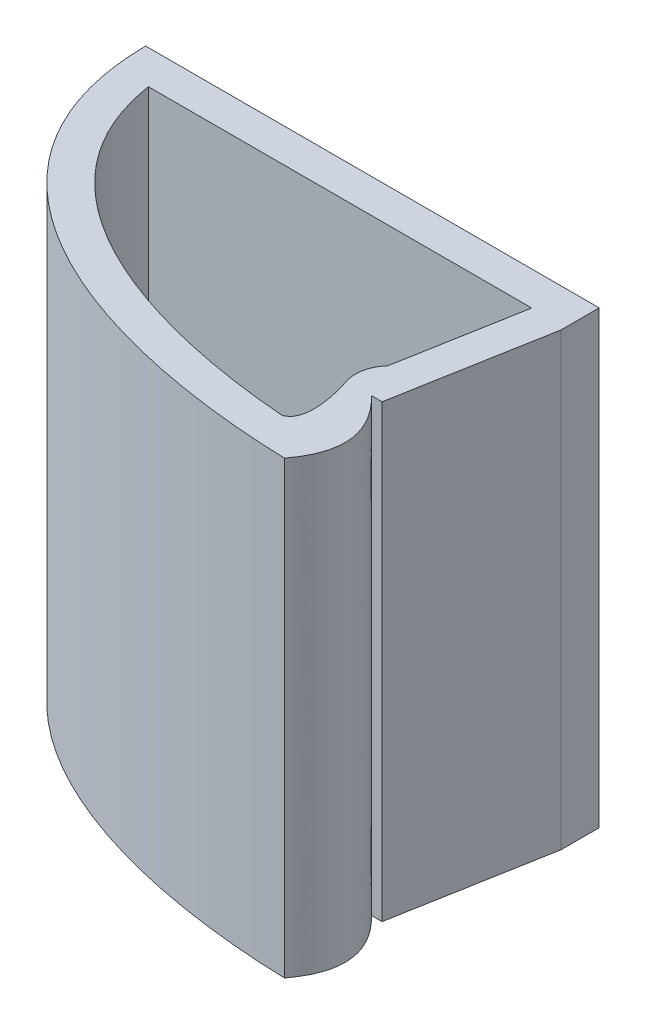
ISO-10303-21;
HEADER;
FILE_DESCRIPTION(('STEP AP214'),'2;1');
FILE_NAME('part.step','',(''),(''),'','','');
FILE_SCHEMA(('AUTOMOTIVE_DESIGN { 1 0 10303 214 1 1 1 1 }'));
ENDSEC;
DATA;
#1=APPLICATION_CONTEXT('core data for automotive mechanical design processes');
#2=APPLICATION_PROTOCOL_DEFINITION('international standard','automotive_design',2000,#1);
#3=PRODUCT_CONTEXT('',#1,'mechanical');
#4=PRODUCT('Part','Part','',(#3));
#5=PRODUCT_RELATED_PRODUCT_CATEGORY('part','',(#4));
#6=PRODUCT_DEFINITION_FORMATION('','',#4);
#7=PRODUCT_DEFINITION_CONTEXT('part definition',#1,'design');
#8=PRODUCT_DEFINITION('design','',#6,#7);
#9=PRODUCT_DEFINITION_SHAPE('','',#8);
#10=(LENGTH_UNIT() NAMED_UNIT(*) SI_UNIT(.MILLI.,.METRE.));
#11=(NAMED_UNIT(*) PLANE_ANGLE_UNIT() SI_UNIT($,.RADIAN.));
#12=(NAMED_UNIT(*) SI_UNIT($,.STERADIAN.) SOLID_ANGLE_UNIT());
#13=UNCERTAINTY_MEASURE_WITH_UNIT(LENGTH_MEASURE(1.E-05),#10,'distance_accuracy_value','');
#14=(GEOMETRIC_REPRESENTATION_CONTEXT(3) GLOBAL_UNCERTAINTY_ASSIGNED_CONTEXT((#13)) GLOBAL_UNIT_ASSIGNED_CONTEXT((#10,
#11,#12)) REPRESENTATION_CONTEXT('',''));
#15=CARTESIAN_POINT('',(0.,0.,0.));
#16=DIRECTION('',(0.,0.,1.));
#17=DIRECTION('',(1.,0.,0.));
#18=AXIS2_PLACEMENT_3D('',#15,#16,#17);
#19=CARTESIAN_POINT('',(0.,0.,8.5));
#20=DIRECTION('',(0.,1.,0.));
#21=DIRECTION('',(0.,0.,1.));
#22=AXIS2_PLACEMENT_3D('',#19,#20,#21);
#23=PLANE('',#22);
#24=CARTESIAN_POINT('',(11.1620504540405,0.,4.60780146488665));
#25=CARTESIAN_POINT('',(11.2131675079715,0.,4.72445154131894));
#26=CARTESIAN_POINT('',(11.3147638241171,0.,4.96538924891427));
#27=CARTESIAN_POINT('',(11.4830948316739,0.,5.40333885241425));
#28=CARTESIAN_POINT('',(11.6431962681968,0.,5.90112804710478));
#29=CARTESIAN_POINT('',(11.7519405630248,0.,6.40222154057905));
#30=CARTESIAN_POINT('',(11.7836844762821,0.,6.80084272308185));
#31=CARTESIAN_POINT('',(11.7523982831564,0.,7.08524004060869));
#32=CARTESIAN_POINT('',(11.6838538460641,0.,7.25591900293486));
#33=CARTESIAN_POINT('',(11.6139489480084,0.,7.34882283848149));
#34=CARTESIAN_POINT('',(11.5192149941438,0.,7.4113415692806));
#35=CARTESIAN_POINT('',(11.4725849601834,0.,7.43298576678262));
#36=B_SPLINE_CURVE_WITH_KNOTS('',3,(#24,#25,#26,#27,#28,#29,#30,#31,#32,#33,#34,#35),
.UNSPECIFIED.,.F.,.F.,(4,1,1,1,1,1,1,1,1,4),(0.498991895114346,0.499066729925551,
0.499141564736756,0.499291234359166,0.499440903981576,0.499590573603986,0.499740243226396,
0.499889912848806,0.500039582471215,0.500189252093625),.UNSPECIFIED.);
#37=CARTESIAN_POINT('',(11.5419481656398,0.,5.59329746128321));
#38=VERTEX_POINT('',#37);
#39=CARTESIAN_POINT('',(11.4725849601834,0.,7.43298576678262));
#40=VERTEX_POINT('',#39);
#41=EDGE_CURVE('E143',#38,#40,#36,.T.);
#42=ORIENTED_EDGE('',*,*,#41,.F.);
#43=CARTESIAN_POINT('',(12.4935437027257,0.,5.28594435198049));
#44=DIRECTION('',(0.,1.,0.));
#45=DIRECTION('',(0.,0.,1.));
#46=AXIS2_PLACEMENT_3D('',#43,#44,#45);
#47=CIRCLE('',#46,1.);
#48=CARTESIAN_POINT('',(11.7586136212322,0.,4.60780146488665));
#49=VERTEX_POINT('',#48);
#50=EDGE_CURVE('E41',#38,#49,#47,.F.);
#51=ORIENTED_EDGE('',*,*,#50,.T.);
#52=DIRECTION('',(-0.176820558962602,0.,0.984243105095562));
#53=VECTOR('',#52,1.);
#54=CARTESIAN_POINT('',(13.8355312823806,0.,-6.95302551037978));
#55=LINE('',#54,#53);
#56=CARTESIAN_POINT('',(12.4,0.,1.03762769828319));
#57=VERTEX_POINT('',#56);
#58=EDGE_CURVE('E150',#57,#49,#55,.T.);
#59=ORIENTED_EDGE('',*,*,#58,.F.);
#60=DIRECTION('',(0.,0.,1.));
#61=VECTOR('',#60,1.);
#62=CARTESIAN_POINT('',(12.4,0.,-8.23493302216588));
#63=LINE('',#62,#61);
#64=CARTESIAN_POINT('',(12.4,0.,0.999999999999999));
#65=VERTEX_POINT('',#64);
#66=EDGE_CURVE('E148',#65,#57,#63,.T.);
#67=ORIENTED_EDGE('',*,*,#66,.F.);
#68=DIRECTION('',(1.,0.,3.82658585370386E-13));
#69=VECTOR('',#68,1.);
#70=CARTESIAN_POINT('',(6.69999999999647,0.,0.999999999997819));
#71=LINE('',#70,#69);
#72=CARTESIAN_POINT('',(1.082503611975,0.,0.999999999995669));
#73=VERTEX_POINT('',#72);
#74=EDGE_CURVE('E126',#73,#65,#71,.T.);
#75=ORIENTED_EDGE('',*,*,#74,.F.);
#76=CARTESIAN_POINT('',(11.4725849601834,0.,7.43298576678262));
#77=CARTESIAN_POINT('',(10.8937459111339,0.,7.38920843009865));
#78=CARTESIAN_POINT('',(9.75124911604621,0.,7.26197207924632));
#79=CARTESIAN_POINT('',(7.39384139917749,0.,6.80592369249585));
#80=CARTESIAN_POINT('',(5.16927017823136,0.,6.01785755759137));
#81=CARTESIAN_POINT('',(3.35518405046679,0.,4.85833816615027));
#82=CARTESIAN_POINT('',(2.26283723713573,0.,3.80503841848416));
#83=CARTESIAN_POINT('',(1.60534323042404,0.,2.75907774672282));
#84=CARTESIAN_POINT('',(1.24696521966785,0.,1.80837534594197));
#85=CARTESIAN_POINT('',(1.12462313535771,0.,1.2673203489155));
#86=CARTESIAN_POINT('',(1.082503611975,0.,0.999999999995669));
#87=B_SPLINE_CURVE_WITH_KNOTS('',3,(#76,#77,#78,#79,#80,#81,#82,#83,#84,#85,#86),.UNSPECIFIED.,
.F.,.F.,(4,1,1,1,1,1,1,1,4),(0.071068840851036,0.173545681339634,0.276022521828232,
0.480976202805427,0.583453043294025,0.685929883782623,0.788406724271221,0.83964514451552,
0.890883564759819),.UNSPECIFIED.);
#88=EDGE_CURVE('E138',#40,#73,#87,.T.);
#89=ORIENTED_EDGE('',*,*,#88,.F.);
#90=EDGE_LOOP('',(#42,#51,#59,#67,#75,#89));
#91=FACE_BOUND('',#90,.T.);
#92=DIRECTION('',(0.,0.,-1.));
#93=VECTOR('',#92,1.);
#94=CARTESIAN_POINT('',(13.4,0.,8.5));
#95=LINE('',#94,#93);
#96=CARTESIAN_POINT('',(13.4,0.,1.12674004470312));
#97=VERTEX_POINT('',#96);
#98=CARTESIAN_POINT('',(13.4,0.,0.));
#99=VERTEX_POINT('',#98);
#100=EDGE_CURVE('E210',#97,#99,#95,.T.);
#101=ORIENTED_EDGE('',*,*,#100,.F.);
#102=DIRECTION('',(0.176820558962603,0.,-0.984243105095562));
#103=VECTOR('',#102,1.);
#104=CARTESIAN_POINT('',(14.8204739720635,0.,-6.78009907611944));
#105=LINE('',#104,#103);
#106=CARTESIAN_POINT('',(12.594971464915,0.,5.60780146488665));
#107=VERTEX_POINT('',#106);
#108=EDGE_CURVE('E186',#107,#97,#105,.T.);
#109=ORIENTED_EDGE('',*,*,#108,.F.);
#110=DIRECTION('',(1.,0.,0.));
#111=VECTOR('',#110,1.);
#112=CARTESIAN_POINT('',(6.70479542328652,0.,5.60780146488665));
#113=LINE('',#112,#111);
#114=CARTESIAN_POINT('',(12.2779896895053,0.,5.60780146488665));
#115=VERTEX_POINT('',#114);
#116=EDGE_CURVE('E198',#115,#107,#113,.T.);
#117=ORIENTED_EDGE('',*,*,#116,.F.);
#118=CARTESIAN_POINT('',(12.594971464915,0.,8.49164180262342));
#119=CARTESIAN_POINT('',(13.7290057015637,0.,6.99482878574301));
#120=CARTESIAN_POINT('',(12.2779896895053,0.,5.60780146488665));
#121=B_SPLINE_CURVE_WITH_KNOTS('',2,(#118,#119,#120),.UNSPECIFIED.,.F.,.F.,(3,3),(0.,1.),.UNSPECIFIED.);
#122=CARTESIAN_POINT('',(12.5949714649245,0.,8.49164180262369));
#123=VERTEX_POINT('',#122);
#124=EDGE_CURVE('E160',#123,#115,#121,.T.);
#125=ORIENTED_EDGE('',*,*,#124,.F.);
#126=CARTESIAN_POINT('',(0.,0.,0.));
#127=CARTESIAN_POINT('',(0.0751868984353946,0.,6.84354411371132));
#128=CARTESIAN_POINT('',(8.19765984473702,0.,8.53411534610218));
#129=CARTESIAN_POINT('',(13.4,0.,8.5));
#130=B_SPLINE_CURVE_WITH_KNOTS('',3,(#126,#127,#128,#129),.UNSPECIFIED.,.F.,.F.,(4,4),(0.,1.),.UNSPECIFIED.);
#131=CARTESIAN_POINT('',(0.,0.,0.));
#132=VERTEX_POINT('',#131);
#133=EDGE_CURVE('E285',#132,#123,#130,.T.);
#134=ORIENTED_EDGE('',*,*,#133,.F.);
#135=DIRECTION('',(1.,0.,0.));
#136=VECTOR('',#135,1.);
#137=CARTESIAN_POINT('',(0.,0.,0.));
#138=LINE('',#137,#136);
#139=EDGE_CURVE('E297',#132,#99,#138,.T.);
#140=ORIENTED_EDGE('',*,*,#139,.T.);
#141=EDGE_LOOP('',(#101,#109,#117,#125,#134,#140));
#142=FACE_BOUND('',#141,.T.);
#143=ADVANCED_FACE('F33',(#91,#142),#23,.F.);
#144=CARTESIAN_POINT('',(13.4,0.,8.5));
#145=DIRECTION('',(-1.,0.,0.));
#146=DIRECTION('',(0.,0.,1.));
#147=AXIS2_PLACEMENT_3D('',#144,#145,#146);
#148=PLANE('',#147);
#149=DIRECTION('',(0.,0.,-1.));
#150=VECTOR('',#149,1.);
#151=CARTESIAN_POINT('',(13.4,13.3,8.5));
#152=LINE('',#151,#150);
#153=CARTESIAN_POINT('',(13.4,13.3,1.12674004470312));
#154=VERTEX_POINT('',#153);
#155=CARTESIAN_POINT('',(13.4,13.3,0.));
#156=VERTEX_POINT('',#155);
#157=EDGE_CURVE('E290',#154,#156,#152,.T.);
#158=ORIENTED_EDGE('',*,*,#157,.F.);
#159=DIRECTION('',(0.,-1.,0.));
#160=VECTOR('',#159,1.);
#161=CARTESIAN_POINT('',(13.4,13.3,1.12674004470312));
#162=LINE('',#161,#160);
#163=EDGE_CURVE('E288',#154,#97,#162,.T.);
#164=ORIENTED_EDGE('',*,*,#163,.T.);
#165=ORIENTED_EDGE('',*,*,#100,.T.);
#166=DIRECTION('',(0.,1.,0.));
#167=VECTOR('',#166,1.);
#168=CARTESIAN_POINT('',(13.4,0.,0.));
#169=LINE('',#168,#167);
#170=EDGE_CURVE('E295',#99,#156,#169,.T.);
#171=ORIENTED_EDGE('',*,*,#170,.T.);
#172=EDGE_LOOP('',(#158,#164,#165,#171));
#173=FACE_BOUND('',#172,.T.);
#174=ADVANCED_FACE('F250',(#173),#148,.F.);
#175=CARTESIAN_POINT('',(0.,13.3,8.5));
#176=DIRECTION('',(0.,-1.,0.));
#177=DIRECTION('',(0.,0.,-1.));
#178=AXIS2_PLACEMENT_3D('',#175,#176,#177);
#179=PLANE('',#178);
#180=DIRECTION('',(-0.176820558962602,0.,0.984243105095562));
#181=VECTOR('',#180,1.);
#182=CARTESIAN_POINT('',(10.7135980696195,13.3,10.424711882017));
#183=LINE('',#182,#181);
#184=CARTESIAN_POINT('',(12.4,13.3000025,1.03762769828319));
#185=VERTEX_POINT('',#184);
#186=CARTESIAN_POINT('',(11.7586136212322,13.3,4.60780146488665));
#187=VERTEX_POINT('',#186);
#188=EDGE_CURVE('E224',#185,#187,#183,.T.);
#189=ORIENTED_EDGE('',*,*,#188,.T.);
#190=CARTESIAN_POINT('',(12.4935437027257,13.3,5.28594435198049));
#191=DIRECTION('',(0.,-1.,0.));
#192=DIRECTION('',(0.,0.,-1.));
#193=AXIS2_PLACEMENT_3D('',#190,#191,#192);
#194=CIRCLE('',#193,1.);
#195=CARTESIAN_POINT('',(11.5419481656398,13.3,5.59329746128321));
#196=VERTEX_POINT('',#195);
#197=EDGE_CURVE('E11',#187,#196,#194,.F.);
#198=ORIENTED_EDGE('',*,*,#197,.T.);
#199=CARTESIAN_POINT('',(11.1620504540405,13.3,4.60780146488665));
#200=CARTESIAN_POINT('',(11.2131675079715,13.3,4.72445154131894));
#201=CARTESIAN_POINT('',(11.3147638241171,13.3,4.96538924891427));
#202=CARTESIAN_POINT('',(11.4830948316739,13.3,5.40333885241425));
#203=CARTESIAN_POINT('',(11.6431962681968,13.3,5.90112804710478));
#204=CARTESIAN_POINT('',(11.7519405630248,13.3,6.40222154057905));
#205=CARTESIAN_POINT('',(11.7836844762821,13.3,6.80084272308185));
#206=CARTESIAN_POINT('',(11.7523982831564,13.3,7.08524004060869));
#207=CARTESIAN_POINT('',(11.6838538460641,13.3,7.25591900293486));
#208=CARTESIAN_POINT('',(11.6139489480084,13.3,7.34882283848149));
#209=CARTESIAN_POINT('',(11.5192149941438,13.3,7.4113415692806));
#210=CARTESIAN_POINT('',(11.4725849601834,13.3,7.43298576678262));
#211=B_SPLINE_CURVE_WITH_KNOTS('',3,(#199,#200,#201,#202,#203,#204,#205,#206,#207,#208,#209,
#210),.UNSPECIFIED.,.F.,.F.,(4,1,1,1,1,1,1,1,1,4),(0.498991895114346,0.499066729925551,
0.499141564736756,0.499291234359166,0.499440903981576,0.499590573603986,0.499740243226396,
0.499889912848806,0.500039582471215,0.500189252093625),.UNSPECIFIED.);
#212=CARTESIAN_POINT('',(11.4725849601834,13.3,7.43298576678262));
#213=VERTEX_POINT('',#212);
#214=EDGE_CURVE('E226',#196,#213,#211,.T.);
#215=ORIENTED_EDGE('',*,*,#214,.T.);
#216=CARTESIAN_POINT('',(11.4725849601834,13.3,7.43298576678262));
#217=CARTESIAN_POINT('',(10.8937459111339,13.3,7.38920843009865));
#218=CARTESIAN_POINT('',(9.75124911604621,13.3,7.26197207924632));
#219=CARTESIAN_POINT('',(7.39384139917749,13.3,6.80592369249585));
#220=CARTESIAN_POINT('',(5.16927017823136,13.3,6.01785755759137));
#221=CARTESIAN_POINT('',(3.35518405046679,13.3,4.85833816615027));
#222=CARTESIAN_POINT('',(2.26283723713573,13.3,3.80503841848416));
#223=CARTESIAN_POINT('',(1.60534323042404,13.3,2.75907774672282));
#224=CARTESIAN_POINT('',(1.24696521966785,13.3,1.80837534594197));
#225=CARTESIAN_POINT('',(1.12462313535771,13.3,1.2673203489155));
#226=CARTESIAN_POINT('',(1.082503611975,13.3,0.999999999995669));
#227=B_SPLINE_CURVE_WITH_KNOTS('',3,(#216,#217,#218,#219,#220,#221,#222,#223,#224,#225,#226),
.UNSPECIFIED.,.F.,.F.,(4,1,1,1,1,1,1,1,4),(0.071068840851036,0.173545681339634,
0.276022521828232,0.480976202805427,0.583453043294025,0.685929883782623,0.788406724271221,
0.83964514451552,0.890883564759819),.UNSPECIFIED.);
#228=CARTESIAN_POINT('',(1.082503611975,13.3,0.999999999995669));
#229=VERTEX_POINT('',#228);
#230=EDGE_CURVE('E203',#213,#229,#227,.T.);
#231=ORIENTED_EDGE('',*,*,#230,.T.);
#232=DIRECTION('',(1.,0.,3.82658585370386E-13));
#233=VECTOR('',#232,1.);
#234=CARTESIAN_POINT('',(2.86993939027971E-12,13.3,0.999999999995255));
#235=LINE('',#234,#233);
#236=CARTESIAN_POINT('',(12.4,13.3,0.999999999999999));
#237=VERTEX_POINT('',#236);
#238=EDGE_CURVE('E129',#229,#237,#235,.T.);
#239=ORIENTED_EDGE('',*,*,#238,.T.);
#240=DIRECTION('',(0.,0.,1.));
#241=VECTOR('',#240,1.);
#242=CARTESIAN_POINT('',(12.4,13.3,8.5));
#243=LINE('',#242,#241);
#244=EDGE_CURVE('E215',#237,#185,#243,.T.);
#245=ORIENTED_EDGE('',*,*,#244,.T.);
#246=EDGE_LOOP('',(#189,#198,#215,#231,#239,#245));
#247=FACE_BOUND('',#246,.T.);
#248=DIRECTION('',(1.,0.,0.));
#249=VECTOR('',#248,1.);
#250=CARTESIAN_POINT('',(6.70479542328652,13.3,5.60780146488665));
#251=LINE('',#250,#249);
#252=CARTESIAN_POINT('',(12.2779896895053,13.3,5.60780146488665));
#253=VERTEX_POINT('',#252);
#254=CARTESIAN_POINT('',(12.594971464915,13.3,5.60780146488665));
#255=VERTEX_POINT('',#254);
#256=EDGE_CURVE('E171',#253,#255,#251,.T.);
#257=ORIENTED_EDGE('',*,*,#256,.T.);
#258=DIRECTION('',(0.176820558962603,0.,-0.984243105095562));
#259=VECTOR('',#258,1.);
#260=CARTESIAN_POINT('',(14.8204739720635,13.3,-6.78009907611944));
#261=LINE('',#260,#259);
#262=EDGE_CURVE('E193',#255,#154,#261,.T.);
#263=ORIENTED_EDGE('',*,*,#262,.T.);
#264=ORIENTED_EDGE('',*,*,#157,.T.);
#265=DIRECTION('',(-1.,0.,0.));
#266=VECTOR('',#265,1.);
#267=CARTESIAN_POINT('',(0.,13.3,0.));
#268=LINE('',#267,#266);
#269=CARTESIAN_POINT('',(0.,13.3,0.));
#270=VERTEX_POINT('',#269);
#271=EDGE_CURVE('E292',#156,#270,#268,.T.);
#272=ORIENTED_EDGE('',*,*,#271,.T.);
#273=CARTESIAN_POINT('',(0.,13.3,0.));
#274=CARTESIAN_POINT('',(0.0751868984353946,13.3,6.84354411371132));
#275=CARTESIAN_POINT('',(8.19765984473702,13.3,8.53411534610218));
#276=CARTESIAN_POINT('',(13.4,13.3,8.5));
#277=B_SPLINE_CURVE_WITH_KNOTS('',3,(#273,#274,#275,#276),.UNSPECIFIED.,.F.,.F.,(4,4),(0.,1.),.UNSPECIFIED.);
#278=CARTESIAN_POINT('',(12.5949714649245,13.3,8.49164180262368));
#279=VERTEX_POINT('',#278);
#280=EDGE_CURVE('E187',#270,#279,#277,.T.);
#281=ORIENTED_EDGE('',*,*,#280,.T.);
#282=CARTESIAN_POINT('',(12.594971464915,13.3,8.49164180262342));
#283=CARTESIAN_POINT('',(13.7290057015637,13.3,6.99482878574301));
#284=CARTESIAN_POINT('',(12.2779896895053,13.3,5.60780146488665));
#285=B_SPLINE_CURVE_WITH_KNOTS('',2,(#282,#283,#284),.UNSPECIFIED.,.F.,.F.,(3,3),(0.,1.),.UNSPECIFIED.);
#286=EDGE_CURVE('E182',#279,#253,#285,.T.);
#287=ORIENTED_EDGE('',*,*,#286,.T.);
#288=EDGE_LOOP('',(#257,#263,#264,#272,#281,#287));
#289=FACE_BOUND('',#288,.T.);
#290=ADVANCED_FACE('F237',(#247,#289),#179,.F.);
#291=CARTESIAN_POINT('',(0.,13.3,0.));
#292=DIRECTION('',(0.,0.,-1.));
#293=DIRECTION('',(-1.,0.,0.));
#294=AXIS2_PLACEMENT_3D('',#291,#292,#293);
#295=PLANE('',#294);
#296=DIRECTION('',(0.,-1.,0.));
#297=VECTOR('',#296,1.);
#298=CARTESIAN_POINT('',(0.,0.,0.));
#299=LINE('',#298,#297);
#300=EDGE_CURVE('E280',#270,#132,#299,.T.);
#301=ORIENTED_EDGE('',*,*,#300,.F.);
#302=ORIENTED_EDGE('',*,*,#271,.F.);
#303=ORIENTED_EDGE('',*,*,#170,.F.);
#304=ORIENTED_EDGE('',*,*,#139,.F.);
#305=EDGE_LOOP('',(#301,#302,#303,#304));
#306=FACE_BOUND('',#305,.T.);
#307=ADVANCED_FACE('F259',(#306),#295,.T.);
#308=DIRECTION('',(0.,-1.,0.));
#309=VECTOR('',#308,1.);
#310=SURFACE_OF_LINEAR_EXTRUSION('',#277,#309);
#311=ORIENTED_EDGE('',*,*,#133,.T.);
#312=DIRECTION('',(0.,-1.,0.));
#313=VECTOR('',#312,1.);
#314=CARTESIAN_POINT('',(12.5949714649245,13.3,8.49164180262369));
#315=LINE('',#314,#313);
#316=EDGE_CURVE('E190',#279,#123,#315,.T.);
#317=ORIENTED_EDGE('',*,*,#316,.F.);
#318=ORIENTED_EDGE('',*,*,#280,.F.);
#319=ORIENTED_EDGE('',*,*,#300,.T.);
#320=EDGE_LOOP('',(#311,#317,#318,#319));
#321=FACE_BOUND('',#320,.T.);
#322=ADVANCED_FACE('F261',(#321),#310,.F.);
#323=CARTESIAN_POINT('',(14.8204739720635,13.3,-6.78009907611944));
#324=DIRECTION('',(-0.984243105095562,0.,-0.176820558962603));
#325=DIRECTION('',(-0.176820558962603,0.,0.984243105095562));
#326=AXIS2_PLACEMENT_3D('',#323,#324,#325);
#327=PLANE('',#326);
#328=ORIENTED_EDGE('',*,*,#108,.T.);
#329=ORIENTED_EDGE('',*,*,#163,.F.);
#330=ORIENTED_EDGE('',*,*,#262,.F.);
#331=DIRECTION('',(0.,-1.,0.));
#332=VECTOR('',#331,1.);
#333=CARTESIAN_POINT('',(12.594971464915,13.3,5.60780146488665));
#334=LINE('',#333,#332);
#335=EDGE_CURVE('E318',#255,#107,#334,.T.);
#336=ORIENTED_EDGE('',*,*,#335,.T.);
#337=EDGE_LOOP('',(#328,#329,#330,#336));
#338=FACE_BOUND('',#337,.T.);
#339=ADVANCED_FACE('F264',(#338),#327,.F.);
#340=CARTESIAN_POINT('',(6.70479542328652,13.3,5.60780146488665));
#341=DIRECTION('',(0.,0.,-1.));
#342=DIRECTION('',(-1.,0.,0.));
#343=AXIS2_PLACEMENT_3D('',#340,#341,#342);
#344=PLANE('',#343);
#345=ORIENTED_EDGE('',*,*,#116,.T.);
#346=ORIENTED_EDGE('',*,*,#335,.F.);
#347=ORIENTED_EDGE('',*,*,#256,.F.);
#348=DIRECTION('',(0.,-1.,0.));
#349=VECTOR('',#348,1.);
#350=CARTESIAN_POINT('',(12.2779896895053,13.3,5.60780146488665));
#351=LINE('',#350,#349);
#352=EDGE_CURVE('E192',#253,#115,#351,.T.);
#353=ORIENTED_EDGE('',*,*,#352,.T.);
#354=EDGE_LOOP('',(#345,#346,#347,#353));
#355=FACE_BOUND('',#354,.T.);
#356=ADVANCED_FACE('F322',(#355),#344,.F.);
#357=DIRECTION('',(0.,-1.,0.));
#358=VECTOR('',#357,1.);
#359=SURFACE_OF_LINEAR_EXTRUSION('',#285,#358);
#360=ORIENTED_EDGE('',*,*,#124,.T.);
#361=ORIENTED_EDGE('',*,*,#352,.F.);
#362=ORIENTED_EDGE('',*,*,#286,.F.);
#363=ORIENTED_EDGE('',*,*,#316,.T.);
#364=EDGE_LOOP('',(#360,#361,#362,#363));
#365=FACE_BOUND('',#364,.T.);
#366=ADVANCED_FACE('F178',(#365),#359,.F.);
#367=CARTESIAN_POINT('',(11.1620504540405,13.30005,4.60780146488665));
#368=CARTESIAN_POINT('',(11.2131675079715,13.30005,4.72445154131894));
#369=CARTESIAN_POINT('',(11.3147638241171,13.30005,4.96538924891427));
#370=CARTESIAN_POINT('',(11.4830948316739,13.30005,5.40333885241425));
#371=CARTESIAN_POINT('',(11.6431962681968,13.30005,5.90112804710478));
#372=CARTESIAN_POINT('',(11.7519405630248,13.30005,6.40222154057905));
#373=CARTESIAN_POINT('',(11.7836844762821,13.30005,6.80084272308185));
#374=CARTESIAN_POINT('',(11.7523982831564,13.30005,7.08524004060869));
#375=CARTESIAN_POINT('',(11.6838538460641,13.30005,7.25591900293486));
#376=CARTESIAN_POINT('',(11.6139489480084,13.30005,7.34882283848149));
#377=CARTESIAN_POINT('',(11.5192149941438,13.30005,7.4113415692806));
#378=CARTESIAN_POINT('',(11.4725849601834,13.30005,7.43298576678262));
#379=B_SPLINE_CURVE_WITH_KNOTS('',3,(#367,#368,#369,#370,#371,#372,#373,#374,#375,#376,#377,
#378),.UNSPECIFIED.,.F.,.F.,(4,1,1,1,1,1,1,1,1,4),(0.498991895114346,0.499066729925551,
0.499141564736756,0.499291234359166,0.499440903981576,0.499590573603986,0.499740243226396,
0.499889912848806,0.500039582471215,0.500189252093625),.UNSPECIFIED.);
#380=DIRECTION('',(0.,-1.,0.));
#381=VECTOR('',#380,1.);
#382=SURFACE_OF_LINEAR_EXTRUSION('',#379,#381);
#383=ORIENTED_EDGE('',*,*,#214,.F.);
#384=DIRECTION('',(0.,-1.,0.));
#385=VECTOR('',#384,1.);
#386=CARTESIAN_POINT('',(11.5419481656398,13.3,5.59329746128321));
#387=LINE('',#386,#385);
#388=EDGE_CURVE('E225',#196,#38,#387,.T.);
#389=ORIENTED_EDGE('',*,*,#388,.T.);
#390=ORIENTED_EDGE('',*,*,#41,.T.);
#391=DIRECTION('',(0.,-1.,0.));
#392=VECTOR('',#391,1.);
#393=CARTESIAN_POINT('',(11.4725849601834,13.30005,7.43298576678262));
#394=LINE('',#393,#392);
#395=EDGE_CURVE('E134',#213,#40,#394,.T.);
#396=ORIENTED_EDGE('',*,*,#395,.F.);
#397=EDGE_LOOP('',(#383,#389,#390,#396));
#398=FACE_BOUND('',#397,.T.);
#399=ADVANCED_FACE('F231',(#398),#382,.F.);
#400=CARTESIAN_POINT('',(13.8355312823806,13.30005,-6.95302551037978));
#401=DIRECTION('',(0.984243105095562,0.,0.176820558962602));
#402=DIRECTION('',(0.176820558962602,0.,-0.984243105095562));
#403=AXIS2_PLACEMENT_3D('',#400,#401,#402);
#404=PLANE('',#403);
#405=DIRECTION('',(0.,-1.,0.));
#406=VECTOR('',#405,1.);
#407=CARTESIAN_POINT('',(12.4,13.30005,1.03762769828319));
#408=LINE('',#407,#406);
#409=EDGE_CURVE('E161',#185,#57,#408,.T.);
#410=ORIENTED_EDGE('',*,*,#409,.T.);
#411=ORIENTED_EDGE('',*,*,#58,.T.);
#412=DIRECTION('',(0.,-1.,0.));
#413=VECTOR('',#412,1.);
#414=CARTESIAN_POINT('',(11.7586136212322,13.30005,4.60780146488665));
#415=LINE('',#414,#413);
#416=EDGE_CURVE('E158',#187,#49,#415,.T.);
#417=ORIENTED_EDGE('',*,*,#416,.F.);
#418=ORIENTED_EDGE('',*,*,#188,.F.);
#419=EDGE_LOOP('',(#410,#411,#417,#418));
#420=FACE_BOUND('',#419,.T.);
#421=ADVANCED_FACE('F228',(#420),#404,.F.);
#422=CARTESIAN_POINT('',(12.4,13.30005,-8.23493302216588));
#423=DIRECTION('',(1.,0.,0.));
#424=DIRECTION('',(0.,0.,-1.));
#425=AXIS2_PLACEMENT_3D('',#422,#423,#424);
#426=PLANE('',#425);
#427=DIRECTION('',(0.,-1.,0.));
#428=VECTOR('',#427,1.);
#429=CARTESIAN_POINT('',(12.4,13.30005,0.999999999999999));
#430=LINE('',#429,#428);
#431=EDGE_CURVE('E133',#237,#65,#430,.T.);
#432=ORIENTED_EDGE('',*,*,#431,.T.);
#433=ORIENTED_EDGE('',*,*,#66,.T.);
#434=ORIENTED_EDGE('',*,*,#409,.F.);
#435=ORIENTED_EDGE('',*,*,#244,.F.);
#436=EDGE_LOOP('',(#432,#433,#434,#435));
#437=FACE_BOUND('',#436,.T.);
#438=ADVANCED_FACE('F240',(#437),#426,.F.);
#439=CARTESIAN_POINT('',(6.69999999999647,13.30005,0.999999999997819));
#440=DIRECTION('',(3.82658585370386E-13,0.,-1.));
#441=DIRECTION('',(-1.,0.,-3.82658585370386E-13));
#442=AXIS2_PLACEMENT_3D('',#439,#440,#441);
#443=PLANE('',#442);
#444=DIRECTION('',(0.,-1.,0.));
#445=VECTOR('',#444,1.);
#446=CARTESIAN_POINT('',(1.082503611975,13.30005,0.999999999995669));
#447=LINE('',#446,#445);
#448=EDGE_CURVE('E121',#229,#73,#447,.T.);
#449=ORIENTED_EDGE('',*,*,#448,.T.);
#450=ORIENTED_EDGE('',*,*,#74,.T.);
#451=ORIENTED_EDGE('',*,*,#431,.F.);
#452=ORIENTED_EDGE('',*,*,#238,.F.);
#453=EDGE_LOOP('',(#449,#450,#451,#452));
#454=FACE_BOUND('',#453,.T.);
#455=ADVANCED_FACE('F123',(#454),#443,.F.);
#456=CARTESIAN_POINT('',(11.4725849601834,13.30005,7.43298576678262));
#457=CARTESIAN_POINT('',(10.8937459111339,13.30005,7.38920843009865));
#458=CARTESIAN_POINT('',(9.75124911604621,13.30005,7.26197207924632));
#459=CARTESIAN_POINT('',(7.39384139917749,13.30005,6.80592369249585));
#460=CARTESIAN_POINT('',(5.16927017823136,13.30005,6.01785755759137));
#461=CARTESIAN_POINT('',(3.35518405046679,13.30005,4.85833816615027));
#462=CARTESIAN_POINT('',(2.26283723713573,13.30005,3.80503841848416));
#463=CARTESIAN_POINT('',(1.60534323042404,13.30005,2.75907774672282));
#464=CARTESIAN_POINT('',(1.24696521966785,13.30005,1.80837534594197));
#465=CARTESIAN_POINT('',(1.12462313535771,13.30005,1.2673203489155));
#466=CARTESIAN_POINT('',(1.082503611975,13.30005,0.999999999995669));
#467=B_SPLINE_CURVE_WITH_KNOTS('',3,(#456,#457,#458,#459,#460,#461,#462,#463,#464,#465,#466),
.UNSPECIFIED.,.F.,.F.,(4,1,1,1,1,1,1,1,4),(0.071068840851036,0.173545681339634,
0.276022521828232,0.480976202805427,0.583453043294025,0.685929883782623,0.788406724271221,
0.83964514451552,0.890883564759819),.UNSPECIFIED.);
#468=DIRECTION('',(0.,-1.,0.));
#469=VECTOR('',#468,1.);
#470=SURFACE_OF_LINEAR_EXTRUSION('',#467,#469);
#471=ORIENTED_EDGE('',*,*,#395,.T.);
#472=ORIENTED_EDGE('',*,*,#88,.T.);
#473=ORIENTED_EDGE('',*,*,#448,.F.);
#474=ORIENTED_EDGE('',*,*,#230,.F.);
#475=EDGE_LOOP('',(#471,#472,#473,#474));
#476=FACE_BOUND('',#475,.T.);
#477=ADVANCED_FACE('F139',(#476),#470,.F.);
#478=CARTESIAN_POINT('',(12.4935437027257,6.65,5.28594435198049));
#479=DIRECTION('',(0.,-1.,0.));
#480=DIRECTION('',(0.,0.,-1.));
#481=AXIS2_PLACEMENT_3D('',#478,#479,#480);
#482=CYLINDRICAL_SURFACE('',#481,1.);
#483=ORIENTED_EDGE('',*,*,#197,.F.);
#484=ORIENTED_EDGE('',*,*,#416,.T.);
#485=ORIENTED_EDGE('',*,*,#50,.F.);
#486=ORIENTED_EDGE('',*,*,#388,.F.);
#487=EDGE_LOOP('',(#483,#484,#485,#486));
#488=FACE_BOUND('',#487,.T.);
#489=ADVANCED_FACE('F35',(#488),#482,.T.);
#490=CLOSED_SHELL('',(#143,#174,#290,#307,#322,#339,#356,#366,#399,#421,#438,#455,#477,#489));
#491=MANIFOLD_SOLID_BREP('B2',#490);
#492=ADVANCED_BREP_SHAPE_REPRESENTATION('',(#18,#491),#14);
#493=SHAPE_DEFINITION_REPRESENTATION(#9,#492);
ENDSEC;
END-ISO-10303-21;
